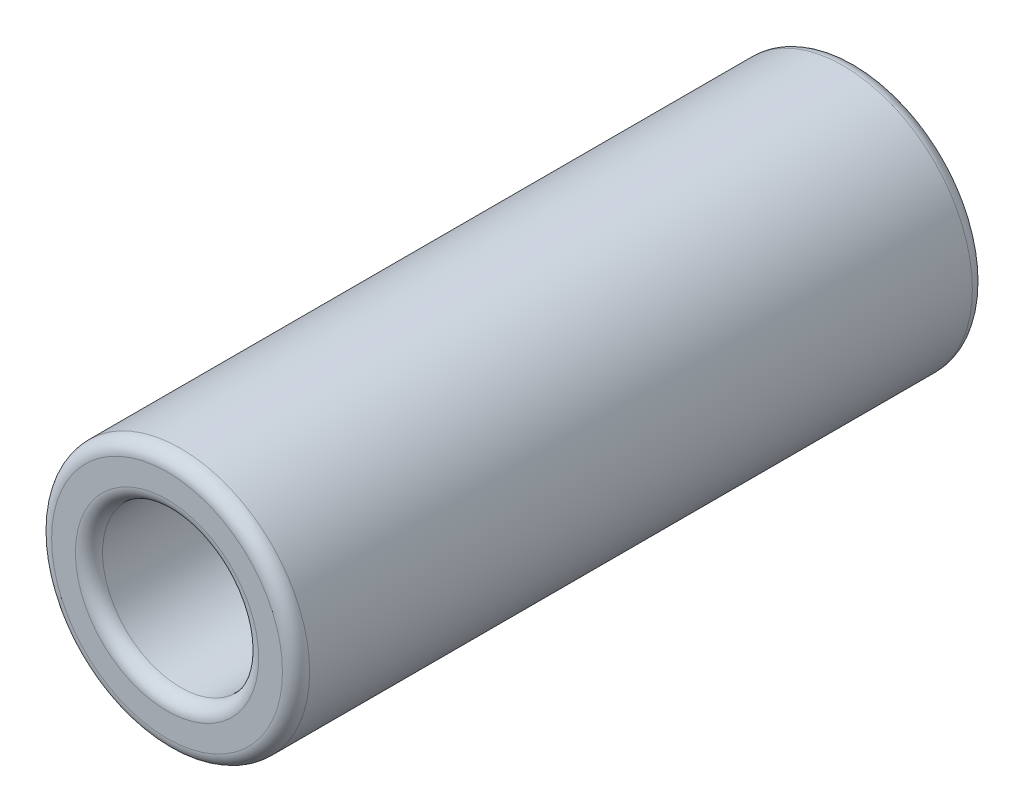
ISO-10303-21;
HEADER;
FILE_DESCRIPTION(('STEP AP214'),'2;1');
FILE_NAME('part.step','',(''),(''),'','','');
FILE_SCHEMA(('AUTOMOTIVE_DESIGN { 1 0 10303 214 1 1 1 1 }'));
ENDSEC;
DATA;
#1=APPLICATION_CONTEXT('core data for automotive mechanical design processes');
#2=APPLICATION_PROTOCOL_DEFINITION('international standard','automotive_design',2000,#1);
#3=PRODUCT_CONTEXT('',#1,'mechanical');
#4=PRODUCT('Part','Part','',(#3));
#5=PRODUCT_RELATED_PRODUCT_CATEGORY('part','',(#4));
#6=PRODUCT_DEFINITION_FORMATION('','',#4);
#7=PRODUCT_DEFINITION_CONTEXT('part definition',#1,'design');
#8=PRODUCT_DEFINITION('design','',#6,#7);
#9=PRODUCT_DEFINITION_SHAPE('','',#8);
#10=(LENGTH_UNIT() NAMED_UNIT(*) SI_UNIT(.MILLI.,.METRE.));
#11=(NAMED_UNIT(*) PLANE_ANGLE_UNIT() SI_UNIT($,.RADIAN.));
#12=(NAMED_UNIT(*) SI_UNIT($,.STERADIAN.) SOLID_ANGLE_UNIT());
#13=UNCERTAINTY_MEASURE_WITH_UNIT(LENGTH_MEASURE(1.E-05),#10,'distance_accuracy_value','');
#14=(GEOMETRIC_REPRESENTATION_CONTEXT(3) GLOBAL_UNCERTAINTY_ASSIGNED_CONTEXT((#13)) GLOBAL_UNIT_ASSIGNED_CONTEXT((#10,
#11,#12)) REPRESENTATION_CONTEXT('',''));
#15=CARTESIAN_POINT('',(0.,0.,0.));
#16=DIRECTION('',(0.,0.,1.));
#17=DIRECTION('',(1.,0.,0.));
#18=AXIS2_PLACEMENT_3D('',#15,#16,#17);
#19=CARTESIAN_POINT('',(0.,0.,50.8));
#20=DIRECTION('',(0.,0.,-1.));
#21=DIRECTION('',(-1.,0.,0.));
#22=AXIS2_PLACEMENT_3D('',#19,#20,#21);
#23=CYLINDRICAL_SURFACE('',#22,9.5);
#24=CARTESIAN_POINT('',(0.,0.,1.));
#25=DIRECTION('',(0.,0.,1.));
#26=DIRECTION('',(1.,0.,0.));
#27=AXIS2_PLACEMENT_3D('',#24,#25,#26);
#28=CIRCLE('',#27,9.5);
#29=CARTESIAN_POINT('',(9.5,0.,1.));
#30=VERTEX_POINT('',#29);
#31=EDGE_CURVE('E44',#30,#30,#28,.T.);
#32=ORIENTED_EDGE('',*,*,#31,.T.);
#33=EDGE_LOOP('',(#32));
#34=FACE_BOUND('',#33,.T.);
#35=CARTESIAN_POINT('',(0.,0.,49.8));
#36=DIRECTION('',(0.,0.,1.));
#37=DIRECTION('',(1.,0.,0.));
#38=AXIS2_PLACEMENT_3D('',#35,#36,#37);
#39=CIRCLE('',#38,9.5);
#40=CARTESIAN_POINT('',(9.5,0.,49.8));
#41=VERTEX_POINT('',#40);
#42=EDGE_CURVE('E48',#41,#41,#39,.F.);
#43=ORIENTED_EDGE('',*,*,#42,.T.);
#44=EDGE_LOOP('',(#43));
#45=FACE_BOUND('',#44,.T.);
#46=ADVANCED_FACE('F33',(#34,#45),#23,.T.);
#47=CARTESIAN_POINT('',(0.,0.,50.8));
#48=DIRECTION('',(0.,0.,1.));
#49=DIRECTION('',(1.,0.,0.));
#50=AXIS2_PLACEMENT_3D('',#47,#48,#49);
#51=PLANE('',#50);
#52=CARTESIAN_POINT('',(0.,0.,50.8));
#53=DIRECTION('',(0.,0.,1.));
#54=DIRECTION('',(1.,0.,0.));
#55=AXIS2_PLACEMENT_3D('',#52,#53,#54);
#56=CIRCLE('',#55,6.75);
#57=CARTESIAN_POINT('',(6.75,0.,50.8));
#58=VERTEX_POINT('',#57);
#59=EDGE_CURVE('E10',#58,#58,#56,.F.);
#60=ORIENTED_EDGE('',*,*,#59,.T.);
#61=EDGE_LOOP('',(#60));
#62=FACE_BOUND('',#61,.T.);
#63=CARTESIAN_POINT('',(0.,0.,50.8));
#64=DIRECTION('',(0.,0.,1.));
#65=DIRECTION('',(1.,0.,0.));
#66=AXIS2_PLACEMENT_3D('',#63,#64,#65);
#67=CIRCLE('',#66,8.5);
#68=CARTESIAN_POINT('',(8.5,0.,50.8));
#69=VERTEX_POINT('',#68);
#70=EDGE_CURVE('E40',#69,#69,#67,.T.);
#71=ORIENTED_EDGE('',*,*,#70,.T.);
#72=EDGE_LOOP('',(#71));
#73=FACE_BOUND('',#72,.T.);
#74=ADVANCED_FACE('F78',(#62,#73),#51,.T.);
#75=CARTESIAN_POINT('',(0.,0.,0.));
#76=DIRECTION('',(0.,0.,1.));
#77=DIRECTION('',(1.,0.,0.));
#78=AXIS2_PLACEMENT_3D('',#75,#76,#77);
#79=PLANE('',#78);
#80=CARTESIAN_POINT('',(0.,0.,0.));
#81=DIRECTION('',(0.,0.,1.));
#82=DIRECTION('',(1.,0.,0.));
#83=AXIS2_PLACEMENT_3D('',#80,#81,#82);
#84=CIRCLE('',#83,6.75);
#85=CARTESIAN_POINT('',(6.75,0.,0.));
#86=VERTEX_POINT('',#85);
#87=EDGE_CURVE('E59',#86,#86,#84,.T.);
#88=ORIENTED_EDGE('',*,*,#87,.T.);
#89=EDGE_LOOP('',(#88));
#90=FACE_BOUND('',#89,.T.);
#91=CARTESIAN_POINT('',(0.,0.,0.));
#92=DIRECTION('',(0.,0.,1.));
#93=DIRECTION('',(1.,0.,0.));
#94=AXIS2_PLACEMENT_3D('',#91,#92,#93);
#95=CIRCLE('',#94,8.5);
#96=CARTESIAN_POINT('',(8.5,0.,0.));
#97=VERTEX_POINT('',#96);
#98=EDGE_CURVE('E62',#97,#97,#95,.F.);
#99=ORIENTED_EDGE('',*,*,#98,.T.);
#100=EDGE_LOOP('',(#99));
#101=FACE_BOUND('',#100,.T.);
#102=ADVANCED_FACE('F66',(#90,#101),#79,.F.);
#103=CARTESIAN_POINT('',(0.,0.,0.));
#104=DIRECTION('',(0.,0.,1.));
#105=DIRECTION('',(1.,0.,0.));
#106=AXIS2_PLACEMENT_3D('',#103,#104,#105);
#107=CYLINDRICAL_SURFACE('',#106,5.75);
#108=CARTESIAN_POINT('',(0.,0.,1.));
#109=DIRECTION('',(0.,0.,1.));
#110=DIRECTION('',(1.,0.,0.));
#111=AXIS2_PLACEMENT_3D('',#108,#109,#110);
#112=CIRCLE('',#111,5.75);
#113=CARTESIAN_POINT('',(5.75,0.,1.));
#114=VERTEX_POINT('',#113);
#115=EDGE_CURVE('E53',#114,#114,#112,.F.);
#116=ORIENTED_EDGE('',*,*,#115,.T.);
#117=EDGE_LOOP('',(#116));
#118=FACE_BOUND('',#117,.T.);
#119=CARTESIAN_POINT('',(0.,0.,49.8));
#120=DIRECTION('',(0.,0.,1.));
#121=DIRECTION('',(1.,0.,0.));
#122=AXIS2_PLACEMENT_3D('',#119,#120,#121);
#123=CIRCLE('',#122,5.75);
#124=CARTESIAN_POINT('',(5.75,0.,49.8));
#125=VERTEX_POINT('',#124);
#126=EDGE_CURVE('E56',#125,#125,#123,.T.);
#127=ORIENTED_EDGE('',*,*,#126,.T.);
#128=EDGE_LOOP('',(#127));
#129=FACE_BOUND('',#128,.T.);
#130=ADVANCED_FACE('F93',(#118,#129),#107,.F.);
#131=CARTESIAN_POINT('',(0.,0.,1.));
#132=DIRECTION('',(0.,0.,1.));
#133=DIRECTION('',(1.,0.,0.));
#134=AXIS2_PLACEMENT_3D('',#131,#132,#133);
#135=TOROIDAL_SURFACE('',#134,6.75,1.);
#136=ORIENTED_EDGE('',*,*,#115,.F.);
#137=EDGE_LOOP('',(#136));
#138=FACE_BOUND('',#137,.T.);
#139=ORIENTED_EDGE('',*,*,#87,.F.);
#140=EDGE_LOOP('',(#139));
#141=FACE_BOUND('',#140,.T.);
#142=ADVANCED_FACE('F72',(#138,#141),#135,.T.);
#143=CARTESIAN_POINT('',(0.,0.,1.));
#144=DIRECTION('',(0.,0.,1.));
#145=DIRECTION('',(1.,0.,0.));
#146=AXIS2_PLACEMENT_3D('',#143,#144,#145);
#147=TOROIDAL_SURFACE('',#146,8.5,1.);
#148=ORIENTED_EDGE('',*,*,#98,.F.);
#149=EDGE_LOOP('',(#148));
#150=FACE_BOUND('',#149,.T.);
#151=ORIENTED_EDGE('',*,*,#31,.F.);
#152=EDGE_LOOP('',(#151));
#153=FACE_BOUND('',#152,.T.);
#154=ADVANCED_FACE('F68',(#150,#153),#147,.T.);
#155=CARTESIAN_POINT('',(0.,0.,49.8));
#156=DIRECTION('',(0.,0.,1.));
#157=DIRECTION('',(1.,0.,0.));
#158=AXIS2_PLACEMENT_3D('',#155,#156,#157);
#159=TOROIDAL_SURFACE('',#158,6.75,1.);
#160=ORIENTED_EDGE('',*,*,#59,.F.);
#161=EDGE_LOOP('',(#160));
#162=FACE_BOUND('',#161,.T.);
#163=ORIENTED_EDGE('',*,*,#126,.F.);
#164=EDGE_LOOP('',(#163));
#165=FACE_BOUND('',#164,.T.);
#166=ADVANCED_FACE('F71',(#162,#165),#159,.T.);
#167=CARTESIAN_POINT('',(0.,0.,49.8));
#168=DIRECTION('',(0.,0.,1.));
#169=DIRECTION('',(1.,0.,0.));
#170=AXIS2_PLACEMENT_3D('',#167,#168,#169);
#171=TOROIDAL_SURFACE('',#170,8.5,1.);
#172=ORIENTED_EDGE('',*,*,#42,.F.);
#173=EDGE_LOOP('',(#172));
#174=FACE_BOUND('',#173,.T.);
#175=ORIENTED_EDGE('',*,*,#70,.F.);
#176=EDGE_LOOP('',(#175));
#177=FACE_BOUND('',#176,.T.);
#178=ADVANCED_FACE('F35',(#174,#177),#171,.T.);
#179=CLOSED_SHELL('',(#46,#74,#102,#130,#142,#154,#166,#178));
#180=MANIFOLD_SOLID_BREP('B2',#179);
#181=ADVANCED_BREP_SHAPE_REPRESENTATION('',(#18,#180),#14);
#182=SHAPE_DEFINITION_REPRESENTATION(#9,#181);
ENDSEC;
END-ISO-10303-21;
